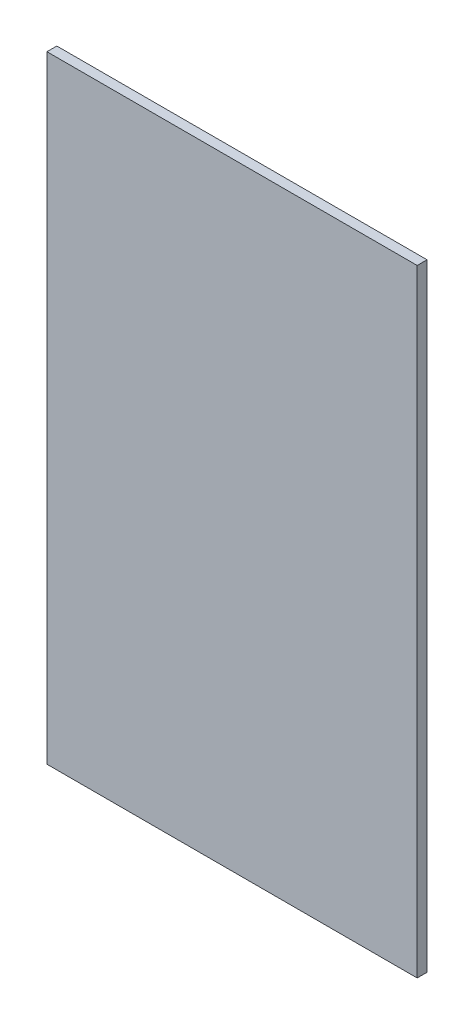
ISO-10303-21;
HEADER;
FILE_DESCRIPTION(('STEP AP214'),'2;1');
FILE_NAME('part.step','',(''),(''),'','','');
FILE_SCHEMA(('AUTOMOTIVE_DESIGN { 1 0 10303 214 1 1 1 1 }'));
ENDSEC;
DATA;
#1=APPLICATION_CONTEXT('core data for automotive mechanical design processes');
#2=APPLICATION_PROTOCOL_DEFINITION('international standard','automotive_design',2000,#1);
#3=PRODUCT_CONTEXT('',#1,'mechanical');
#4=PRODUCT('Part','Part','',(#3));
#5=PRODUCT_RELATED_PRODUCT_CATEGORY('part','',(#4));
#6=PRODUCT_DEFINITION_FORMATION('','',#4);
#7=PRODUCT_DEFINITION_CONTEXT('part definition',#1,'design');
#8=PRODUCT_DEFINITION('design','',#6,#7);
#9=PRODUCT_DEFINITION_SHAPE('','',#8);
#10=(LENGTH_UNIT() NAMED_UNIT(*) SI_UNIT(.MILLI.,.METRE.));
#11=(NAMED_UNIT(*) PLANE_ANGLE_UNIT() SI_UNIT($,.RADIAN.));
#12=(NAMED_UNIT(*) SI_UNIT($,.STERADIAN.) SOLID_ANGLE_UNIT());
#13=UNCERTAINTY_MEASURE_WITH_UNIT(LENGTH_MEASURE(1.E-05),#10,'distance_accuracy_value','');
#14=(GEOMETRIC_REPRESENTATION_CONTEXT(3) GLOBAL_UNCERTAINTY_ASSIGNED_CONTEXT((#13)) GLOBAL_UNIT_ASSIGNED_CONTEXT((#10,
#11,#12)) REPRESENTATION_CONTEXT('',''));
#15=CARTESIAN_POINT('',(0.,0.,0.));
#16=DIRECTION('',(0.,0.,1.));
#17=DIRECTION('',(1.,0.,0.));
#18=AXIS2_PLACEMENT_3D('',#15,#16,#17);
#19=CARTESIAN_POINT('',(1.5,-2.5,0.08));
#20=DIRECTION('',(-1.,0.,0.));
#21=DIRECTION('',(0.,0.,1.));
#22=AXIS2_PLACEMENT_3D('',#19,#20,#21);
#23=PLANE('',#22);
#24=DIRECTION('',(0.,1.,0.));
#25=VECTOR('',#24,1.);
#26=CARTESIAN_POINT('',(1.5,-2.5,0.));
#27=LINE('',#26,#25);
#28=CARTESIAN_POINT('',(1.5,-2.5,0.));
#29=VERTEX_POINT('',#28);
#30=CARTESIAN_POINT('',(1.5,2.5,0.));
#31=VERTEX_POINT('',#30);
#32=EDGE_CURVE('E96',#29,#31,#27,.T.);
#33=ORIENTED_EDGE('',*,*,#32,.T.);
#34=DIRECTION('',(0.,0.,-1.));
#35=VECTOR('',#34,1.);
#36=CARTESIAN_POINT('',(1.5,2.5,0.08));
#37=LINE('',#36,#35);
#38=CARTESIAN_POINT('',(1.5,2.5,0.08));
#39=VERTEX_POINT('',#38);
#40=EDGE_CURVE('E11',#39,#31,#37,.T.);
#41=ORIENTED_EDGE('',*,*,#40,.F.);
#42=DIRECTION('',(0.,1.,0.));
#43=VECTOR('',#42,1.);
#44=CARTESIAN_POINT('',(1.5,-2.5,0.08));
#45=LINE('',#44,#43);
#46=CARTESIAN_POINT('',(1.5,-2.5,0.08));
#47=VERTEX_POINT('',#46);
#48=EDGE_CURVE('E84',#47,#39,#45,.T.);
#49=ORIENTED_EDGE('',*,*,#48,.F.);
#50=DIRECTION('',(0.,0.,-1.));
#51=VECTOR('',#50,1.);
#52=CARTESIAN_POINT('',(1.5,-2.5,0.08));
#53=LINE('',#52,#51);
#54=EDGE_CURVE('E92',#47,#29,#53,.T.);
#55=ORIENTED_EDGE('',*,*,#54,.T.);
#56=EDGE_LOOP('',(#33,#41,#49,#55));
#57=FACE_BOUND('',#56,.T.);
#58=ADVANCED_FACE('F33',(#57),#23,.F.);
#59=CARTESIAN_POINT('',(-1.5,2.5,0.08));
#60=DIRECTION('',(0.,-1.,0.));
#61=DIRECTION('',(0.,0.,-1.));
#62=AXIS2_PLACEMENT_3D('',#59,#60,#61);
#63=PLANE('',#62);
#64=DIRECTION('',(-1.,0.,0.));
#65=VECTOR('',#64,1.);
#66=CARTESIAN_POINT('',(-1.5,2.5,0.));
#67=LINE('',#66,#65);
#68=CARTESIAN_POINT('',(-1.5,2.5,0.));
#69=VERTEX_POINT('',#68);
#70=EDGE_CURVE('E88',#31,#69,#67,.T.);
#71=ORIENTED_EDGE('',*,*,#70,.T.);
#72=DIRECTION('',(0.,0.,-1.));
#73=VECTOR('',#72,1.);
#74=CARTESIAN_POINT('',(-1.5,2.5,0.08));
#75=LINE('',#74,#73);
#76=CARTESIAN_POINT('',(-1.5,2.5,0.08));
#77=VERTEX_POINT('',#76);
#78=EDGE_CURVE('E41',#77,#69,#75,.T.);
#79=ORIENTED_EDGE('',*,*,#78,.F.);
#80=DIRECTION('',(-1.,0.,0.));
#81=VECTOR('',#80,1.);
#82=CARTESIAN_POINT('',(-1.5,2.5,0.08));
#83=LINE('',#82,#81);
#84=EDGE_CURVE('E79',#39,#77,#83,.T.);
#85=ORIENTED_EDGE('',*,*,#84,.F.);
#86=ORIENTED_EDGE('',*,*,#40,.T.);
#87=EDGE_LOOP('',(#71,#79,#85,#86));
#88=FACE_BOUND('',#87,.T.);
#89=ADVANCED_FACE('F87',(#88),#63,.F.);
#90=CARTESIAN_POINT('',(-1.5,-2.5,0.08));
#91=DIRECTION('',(1.,0.,0.));
#92=DIRECTION('',(0.,0.,-1.));
#93=AXIS2_PLACEMENT_3D('',#90,#91,#92);
#94=PLANE('',#93);
#95=DIRECTION('',(0.,-1.,0.));
#96=VECTOR('',#95,1.);
#97=CARTESIAN_POINT('',(-1.5,-2.5,0.));
#98=LINE('',#97,#96);
#99=CARTESIAN_POINT('',(-1.5,-2.5,0.));
#100=VERTEX_POINT('',#99);
#101=EDGE_CURVE('E66',#69,#100,#98,.T.);
#102=ORIENTED_EDGE('',*,*,#101,.T.);
#103=DIRECTION('',(0.,0.,-1.));
#104=VECTOR('',#103,1.);
#105=CARTESIAN_POINT('',(-1.5,-2.5,0.08));
#106=LINE('',#105,#104);
#107=CARTESIAN_POINT('',(-1.5,-2.5,0.08));
#108=VERTEX_POINT('',#107);
#109=EDGE_CURVE('E89',#108,#100,#106,.T.);
#110=ORIENTED_EDGE('',*,*,#109,.F.);
#111=DIRECTION('',(0.,-1.,0.));
#112=VECTOR('',#111,1.);
#113=CARTESIAN_POINT('',(-1.5,-2.5,0.08));
#114=LINE('',#113,#112);
#115=EDGE_CURVE('E82',#77,#108,#114,.T.);
#116=ORIENTED_EDGE('',*,*,#115,.F.);
#117=ORIENTED_EDGE('',*,*,#78,.T.);
#118=EDGE_LOOP('',(#102,#110,#116,#117));
#119=FACE_BOUND('',#118,.T.);
#120=ADVANCED_FACE('F90',(#119),#94,.F.);
#121=CARTESIAN_POINT('',(-1.5,-2.5,0.08));
#122=DIRECTION('',(0.,1.,0.));
#123=DIRECTION('',(0.,0.,1.));
#124=AXIS2_PLACEMENT_3D('',#121,#122,#123);
#125=PLANE('',#124);
#126=DIRECTION('',(1.,0.,0.));
#127=VECTOR('',#126,1.);
#128=CARTESIAN_POINT('',(-1.5,-2.5,0.));
#129=LINE('',#128,#127);
#130=EDGE_CURVE('E72',#100,#29,#129,.T.);
#131=ORIENTED_EDGE('',*,*,#130,.T.);
#132=ORIENTED_EDGE('',*,*,#54,.F.);
#133=DIRECTION('',(1.,0.,0.));
#134=VECTOR('',#133,1.);
#135=CARTESIAN_POINT('',(-1.5,-2.5,0.08));
#136=LINE('',#135,#134);
#137=EDGE_CURVE('E49',#108,#47,#136,.T.);
#138=ORIENTED_EDGE('',*,*,#137,.F.);
#139=ORIENTED_EDGE('',*,*,#109,.T.);
#140=EDGE_LOOP('',(#131,#132,#138,#139));
#141=FACE_BOUND('',#140,.T.);
#142=ADVANCED_FACE('F103',(#141),#125,.F.);
#143=CARTESIAN_POINT('',(0.,0.,0.08));
#144=DIRECTION('',(0.,0.,-1.));
#145=DIRECTION('',(-1.,0.,0.));
#146=AXIS2_PLACEMENT_3D('',#143,#144,#145);
#147=PLANE('',#146);
#148=ORIENTED_EDGE('',*,*,#48,.T.);
#149=ORIENTED_EDGE('',*,*,#84,.T.);
#150=ORIENTED_EDGE('',*,*,#115,.T.);
#151=ORIENTED_EDGE('',*,*,#137,.T.);
#152=EDGE_LOOP('',(#148,#149,#150,#151));
#153=FACE_BOUND('',#152,.T.);
#154=ADVANCED_FACE('F80',(#153),#147,.F.);
#155=CARTESIAN_POINT('',(0.,0.,0.));
#156=DIRECTION('',(0.,0.,-1.));
#157=DIRECTION('',(-1.,0.,0.));
#158=AXIS2_PLACEMENT_3D('',#155,#156,#157);
#159=PLANE('',#158);
#160=ORIENTED_EDGE('',*,*,#32,.F.);
#161=ORIENTED_EDGE('',*,*,#130,.F.);
#162=ORIENTED_EDGE('',*,*,#101,.F.);
#163=ORIENTED_EDGE('',*,*,#70,.F.);
#164=EDGE_LOOP('',(#160,#161,#162,#163));
#165=FACE_BOUND('',#164,.T.);
#166=ADVANCED_FACE('F106',(#165),#159,.T.);
#167=CLOSED_SHELL('',(#58,#89,#120,#142,#154,#166));
#168=MANIFOLD_SOLID_BREP('B2',#167);
#169=ADVANCED_BREP_SHAPE_REPRESENTATION('',(#18,#168),#14);
#170=SHAPE_DEFINITION_REPRESENTATION(#9,#169);
ENDSEC;
END-ISO-10303-21;
